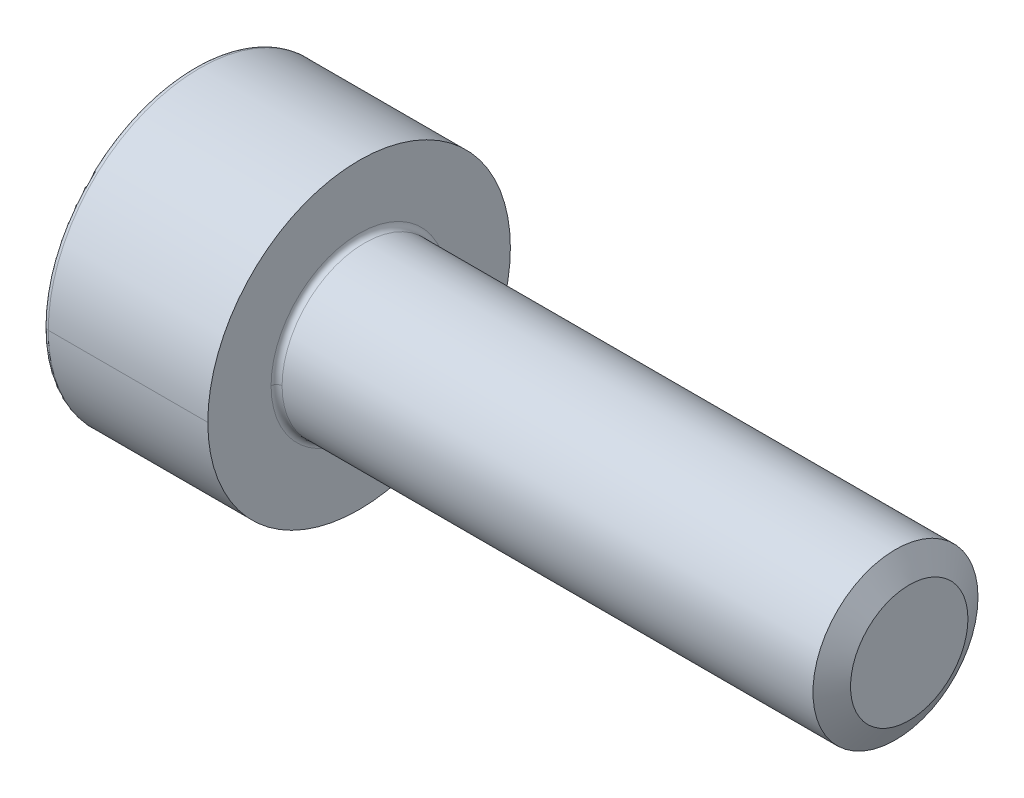
ISO-10303-21;
HEADER;
FILE_DESCRIPTION(('STEP AP214'),'2;1');
FILE_NAME('part.step','',(''),(''),'','','');
FILE_SCHEMA(('AUTOMOTIVE_DESIGN { 1 0 10303 214 1 1 1 1 }'));
ENDSEC;
DATA;
#1=APPLICATION_CONTEXT('core data for automotive mechanical design processes');
#2=APPLICATION_PROTOCOL_DEFINITION('international standard','automotive_design',2000,#1);
#3=PRODUCT_CONTEXT('',#1,'mechanical');
#4=PRODUCT('Part','Part','',(#3));
#5=PRODUCT_RELATED_PRODUCT_CATEGORY('part','',(#4));
#6=PRODUCT_DEFINITION_FORMATION('','',#4);
#7=PRODUCT_DEFINITION_CONTEXT('part definition',#1,'design');
#8=PRODUCT_DEFINITION('design','',#6,#7);
#9=PRODUCT_DEFINITION_SHAPE('','',#8);
#10=(LENGTH_UNIT() NAMED_UNIT(*) SI_UNIT(.MILLI.,.METRE.));
#11=(NAMED_UNIT(*) PLANE_ANGLE_UNIT() SI_UNIT($,.RADIAN.));
#12=(NAMED_UNIT(*) SI_UNIT($,.STERADIAN.) SOLID_ANGLE_UNIT());
#13=UNCERTAINTY_MEASURE_WITH_UNIT(LENGTH_MEASURE(1.E-05),#10,'distance_accuracy_value','');
#14=(GEOMETRIC_REPRESENTATION_CONTEXT(3) GLOBAL_UNCERTAINTY_ASSIGNED_CONTEXT((#13)) GLOBAL_UNIT_ASSIGNED_CONTEXT((#10,
#11,#12)) REPRESENTATION_CONTEXT('',''));
#15=CARTESIAN_POINT('',(0.,0.,0.));
#16=DIRECTION('',(0.,0.,1.));
#17=DIRECTION('',(1.,0.,0.));
#18=AXIS2_PLACEMENT_3D('',#15,#16,#17);
#19=CARTESIAN_POINT('',(0.1,0.,0.));
#20=DIRECTION('',(-1.,0.,0.));
#21=DIRECTION('',(0.,0.,-1.));
#22=AXIS2_PLACEMENT_3D('',#19,#20,#21);
#23=TOROIDAL_SURFACE('',#22,2.65,0.1);
#24=CARTESIAN_POINT('',(0.1,0.,2.65));
#25=DIRECTION('',(0.,-1.,0.));
#26=DIRECTION('',(0.,0.,-1.));
#27=AXIS2_PLACEMENT_3D('',#24,#25,#26);
#28=CIRCLE('',#27,0.1);
#29=CARTESIAN_POINT('',(0.1,0.,2.75));
#30=VERTEX_POINT('',#29);
#31=CARTESIAN_POINT('',(0.,0.,2.65));
#32=VERTEX_POINT('',#31);
#33=EDGE_CURVE('E210',#30,#32,#28,.T.);
#34=ORIENTED_EDGE('',*,*,#33,.T.);
#35=CARTESIAN_POINT('',(0.,0.,0.));
#36=DIRECTION('',(1.,0.,0.));
#37=DIRECTION('',(0.,0.,-1.));
#38=AXIS2_PLACEMENT_3D('',#35,#36,#37);
#39=CIRCLE('',#38,2.65);
#40=CARTESIAN_POINT('',(0.,0.,-2.65));
#41=VERTEX_POINT('',#40);
#42=EDGE_CURVE('E169',#32,#41,#39,.T.);
#43=ORIENTED_EDGE('',*,*,#42,.T.);
#44=CARTESIAN_POINT('',(0.1,0.,-2.65));
#45=DIRECTION('',(0.,1.,0.));
#46=DIRECTION('',(0.,0.,1.));
#47=AXIS2_PLACEMENT_3D('',#44,#45,#46);
#48=CIRCLE('',#47,0.1);
#49=CARTESIAN_POINT('',(0.1,0.,-2.75));
#50=VERTEX_POINT('',#49);
#51=EDGE_CURVE('E224',#50,#41,#48,.T.);
#52=ORIENTED_EDGE('',*,*,#51,.F.);
#53=CARTESIAN_POINT('',(0.1,0.,0.));
#54=DIRECTION('',(-1.,0.,0.));
#55=DIRECTION('',(0.,0.,-1.));
#56=AXIS2_PLACEMENT_3D('',#53,#54,#55);
#57=CIRCLE('',#56,2.75);
#58=EDGE_CURVE('E201',#50,#30,#57,.T.);
#59=ORIENTED_EDGE('',*,*,#58,.T.);
#60=EDGE_LOOP('',(#34,#43,#52,#59));
#61=FACE_BOUND('',#60,.T.);
#62=ADVANCED_FACE('F38',(#61),#23,.T.);
#63=CARTESIAN_POINT('',(1.3,-0.7175,-1.24274645443067));
#64=DIRECTION('',(-1.,0.,0.));
#65=DIRECTION('',(0.,0.,-1.));
#66=AXIS2_PLACEMENT_3D('',#63,#64,#65);
#67=PLANE('',#66);
#68=DIRECTION('',(0.,0.5,-0.866025403784439));
#69=VECTOR('',#68,1.);
#70=CARTESIAN_POINT('',(1.3,-1.435,0.));
#71=LINE('',#70,#69);
#72=CARTESIAN_POINT('',(1.3,-1.435,0.));
#73=VERTEX_POINT('',#72);
#74=CARTESIAN_POINT('',(1.3,-0.7175,-1.24274645443067));
#75=VERTEX_POINT('',#74);
#76=EDGE_CURVE('E252',#73,#75,#71,.T.);
#77=ORIENTED_EDGE('',*,*,#76,.F.);
#78=DIRECTION('',(0.,-0.5,-0.866025403784439));
#79=VECTOR('',#78,1.);
#80=CARTESIAN_POINT('',(1.3,-0.7175,1.24274645443067));
#81=LINE('',#80,#79);
#82=CARTESIAN_POINT('',(1.3,-0.7175,1.24274645443067));
#83=VERTEX_POINT('',#82);
#84=EDGE_CURVE('E257',#83,#73,#81,.T.);
#85=ORIENTED_EDGE('',*,*,#84,.F.);
#86=DIRECTION('',(0.,-1.,0.));
#87=VECTOR('',#86,1.);
#88=CARTESIAN_POINT('',(1.3,0.7175,1.24274645443067));
#89=LINE('',#88,#87);
#90=CARTESIAN_POINT('',(1.3,0.7175,1.24274645443067));
#91=VERTEX_POINT('',#90);
#92=EDGE_CURVE('E243',#91,#83,#89,.T.);
#93=ORIENTED_EDGE('',*,*,#92,.F.);
#94=DIRECTION('',(0.,-0.5,0.866025403784439));
#95=VECTOR('',#94,1.);
#96=CARTESIAN_POINT('',(1.3,1.435,0.));
#97=LINE('',#96,#95);
#98=CARTESIAN_POINT('',(1.3,1.435,0.));
#99=VERTEX_POINT('',#98);
#100=EDGE_CURVE('E176',#99,#91,#97,.T.);
#101=ORIENTED_EDGE('',*,*,#100,.F.);
#102=DIRECTION('',(0.,0.5,0.866025403784439));
#103=VECTOR('',#102,1.);
#104=CARTESIAN_POINT('',(1.3,0.7175,-1.24274645443067));
#105=LINE('',#104,#103);
#106=CARTESIAN_POINT('',(1.3,0.7175,-1.24274645443067));
#107=VERTEX_POINT('',#106);
#108=EDGE_CURVE('E276',#107,#99,#105,.T.);
#109=ORIENTED_EDGE('',*,*,#108,.F.);
#110=DIRECTION('',(0.,1.,0.));
#111=VECTOR('',#110,1.);
#112=CARTESIAN_POINT('',(1.3,-0.7175,-1.24274645443067));
#113=LINE('',#112,#111);
#114=EDGE_CURVE('E11',#75,#107,#113,.T.);
#115=ORIENTED_EDGE('',*,*,#114,.F.);
#116=EDGE_LOOP('',(#77,#85,#93,#101,#109,#115));
#117=FACE_BOUND('',#116,.T.);
#118=ADVANCED_FACE('F340',(#117),#67,.T.);
#119=CARTESIAN_POINT('',(1.3,-0.7175,-1.24274645443067));
#120=DIRECTION('',(0.,0.,-1.));
#121=DIRECTION('',(0.,-1.,0.));
#122=AXIS2_PLACEMENT_3D('',#119,#120,#121);
#123=PLANE('',#122);
#124=DIRECTION('',(0.,1.,0.));
#125=VECTOR('',#124,1.);
#126=CARTESIAN_POINT('',(0.,-0.7175,-1.24274645443067));
#127=LINE('',#126,#125);
#128=CARTESIAN_POINT('',(0.,-0.7175,-1.24274645443067));
#129=VERTEX_POINT('',#128);
#130=CARTESIAN_POINT('',(0.,0.7175,-1.24274645443067));
#131=VERTEX_POINT('',#130);
#132=EDGE_CURVE('E194',#129,#131,#127,.T.);
#133=ORIENTED_EDGE('',*,*,#132,.F.);
#134=DIRECTION('',(-1.,0.,0.));
#135=VECTOR('',#134,1.);
#136=CARTESIAN_POINT('',(1.3,-0.7175,-1.24274645443067));
#137=LINE('',#136,#135);
#138=EDGE_CURVE('E248',#75,#129,#137,.T.);
#139=ORIENTED_EDGE('',*,*,#138,.F.);
#140=ORIENTED_EDGE('',*,*,#114,.T.);
#141=DIRECTION('',(-1.,0.,0.));
#142=VECTOR('',#141,1.);
#143=CARTESIAN_POINT('',(1.3,0.7175,-1.24274645443067));
#144=LINE('',#143,#142);
#145=EDGE_CURVE('E49',#107,#131,#144,.T.);
#146=ORIENTED_EDGE('',*,*,#145,.T.);
#147=EDGE_LOOP('',(#133,#139,#140,#146));
#148=FACE_BOUND('',#147,.T.);
#149=ADVANCED_FACE('F345',(#148),#123,.F.);
#150=CARTESIAN_POINT('',(1.3,0.7175,-1.24274645443067));
#151=DIRECTION('',(0.,0.866025403784439,-0.5));
#152=DIRECTION('',(1.,0.,0.));
#153=AXIS2_PLACEMENT_3D('',#150,#151,#152);
#154=PLANE('',#153);
#155=DIRECTION('',(0.,0.5,0.866025403784439));
#156=VECTOR('',#155,1.);
#157=CARTESIAN_POINT('',(0.,0.7175,-1.24274645443067));
#158=LINE('',#157,#156);
#159=CARTESIAN_POINT('',(0.,1.435,0.));
#160=VERTEX_POINT('',#159);
#161=EDGE_CURVE('E191',#131,#160,#158,.T.);
#162=ORIENTED_EDGE('',*,*,#161,.F.);
#163=ORIENTED_EDGE('',*,*,#145,.F.);
#164=ORIENTED_EDGE('',*,*,#108,.T.);
#165=DIRECTION('',(-1.,0.,0.));
#166=VECTOR('',#165,1.);
#167=CARTESIAN_POINT('',(1.3,1.435,0.));
#168=LINE('',#167,#166);
#169=EDGE_CURVE('E273',#99,#160,#168,.T.);
#170=ORIENTED_EDGE('',*,*,#169,.T.);
#171=EDGE_LOOP('',(#162,#163,#164,#170));
#172=FACE_BOUND('',#171,.T.);
#173=ADVANCED_FACE('F357',(#172),#154,.F.);
#174=CARTESIAN_POINT('',(1.3,1.435,0.));
#175=DIRECTION('',(0.,0.866025403784439,0.5));
#176=DIRECTION('',(-1.,0.,0.));
#177=AXIS2_PLACEMENT_3D('',#174,#175,#176);
#178=PLANE('',#177);
#179=DIRECTION('',(0.,-0.5,0.866025403784439));
#180=VECTOR('',#179,1.);
#181=CARTESIAN_POINT('',(0.,1.435,0.));
#182=LINE('',#181,#180);
#183=CARTESIAN_POINT('',(0.,0.7175,1.24274645443067));
#184=VERTEX_POINT('',#183);
#185=EDGE_CURVE('E189',#160,#184,#182,.T.);
#186=ORIENTED_EDGE('',*,*,#185,.F.);
#187=ORIENTED_EDGE('',*,*,#169,.F.);
#188=ORIENTED_EDGE('',*,*,#100,.T.);
#189=DIRECTION('',(-1.,0.,0.));
#190=VECTOR('',#189,1.);
#191=CARTESIAN_POINT('',(1.3,0.7175,1.24274645443067));
#192=LINE('',#191,#190);
#193=EDGE_CURVE('E277',#91,#184,#192,.T.);
#194=ORIENTED_EDGE('',*,*,#193,.T.);
#195=EDGE_LOOP('',(#186,#187,#188,#194));
#196=FACE_BOUND('',#195,.T.);
#197=ADVANCED_FACE('F353',(#196),#178,.F.);
#198=CARTESIAN_POINT('',(1.3,0.7175,1.24274645443067));
#199=DIRECTION('',(0.,0.,1.));
#200=DIRECTION('',(0.,-1.,0.));
#201=AXIS2_PLACEMENT_3D('',#198,#199,#200);
#202=PLANE('',#201);
#203=DIRECTION('',(0.,-1.,0.));
#204=VECTOR('',#203,1.);
#205=CARTESIAN_POINT('',(0.,0.7175,1.24274645443067));
#206=LINE('',#205,#204);
#207=CARTESIAN_POINT('',(0.,-0.7175,1.24274645443067));
#208=VERTEX_POINT('',#207);
#209=EDGE_CURVE('E186',#184,#208,#206,.T.);
#210=ORIENTED_EDGE('',*,*,#209,.F.);
#211=ORIENTED_EDGE('',*,*,#193,.F.);
#212=ORIENTED_EDGE('',*,*,#92,.T.);
#213=DIRECTION('',(-1.,0.,0.));
#214=VECTOR('',#213,1.);
#215=CARTESIAN_POINT('',(1.3,-0.7175,1.24274645443067));
#216=LINE('',#215,#214);
#217=EDGE_CURVE('E42',#83,#208,#216,.T.);
#218=ORIENTED_EDGE('',*,*,#217,.T.);
#219=EDGE_LOOP('',(#210,#211,#212,#218));
#220=FACE_BOUND('',#219,.T.);
#221=ADVANCED_FACE('F349',(#220),#202,.F.);
#222=CARTESIAN_POINT('',(1.3,-0.7175,1.24274645443067));
#223=DIRECTION('',(0.,-0.866025403784439,0.5));
#224=DIRECTION('',(0.,0.5,0.866025403784439));
#225=AXIS2_PLACEMENT_3D('',#222,#223,#224);
#226=PLANE('',#225);
#227=DIRECTION('',(0.,-0.5,-0.866025403784439));
#228=VECTOR('',#227,1.);
#229=CARTESIAN_POINT('',(0.,-0.7175,1.24274645443067));
#230=LINE('',#229,#228);
#231=CARTESIAN_POINT('',(0.,-1.435,0.));
#232=VERTEX_POINT('',#231);
#233=EDGE_CURVE('E190',#208,#232,#230,.T.);
#234=ORIENTED_EDGE('',*,*,#233,.F.);
#235=ORIENTED_EDGE('',*,*,#217,.F.);
#236=ORIENTED_EDGE('',*,*,#84,.T.);
#237=DIRECTION('',(-1.,0.,0.));
#238=VECTOR('',#237,1.);
#239=CARTESIAN_POINT('',(1.3,-1.435,0.));
#240=LINE('',#239,#238);
#241=EDGE_CURVE('E255',#73,#232,#240,.T.);
#242=ORIENTED_EDGE('',*,*,#241,.T.);
#243=EDGE_LOOP('',(#234,#235,#236,#242));
#244=FACE_BOUND('',#243,.T.);
#245=ADVANCED_FACE('F352',(#244),#226,.F.);
#246=CARTESIAN_POINT('',(1.3,-1.435,0.));
#247=DIRECTION('',(0.,-0.866025403784439,-0.5));
#248=DIRECTION('',(-1.,0.,0.));
#249=AXIS2_PLACEMENT_3D('',#246,#247,#248);
#250=PLANE('',#249);
#251=DIRECTION('',(0.,0.5,-0.866025403784439));
#252=VECTOR('',#251,1.);
#253=CARTESIAN_POINT('',(0.,-1.435,0.));
#254=LINE('',#253,#252);
#255=EDGE_CURVE('E180',#232,#129,#254,.T.);
#256=ORIENTED_EDGE('',*,*,#255,.F.);
#257=ORIENTED_EDGE('',*,*,#241,.F.);
#258=ORIENTED_EDGE('',*,*,#76,.T.);
#259=ORIENTED_EDGE('',*,*,#138,.T.);
#260=EDGE_LOOP('',(#256,#257,#258,#259));
#261=FACE_BOUND('',#260,.T.);
#262=ADVANCED_FACE('F366',(#261),#250,.F.);
#263=CARTESIAN_POINT('',(3.1,0.,0.));
#264=DIRECTION('',(1.,0.,0.));
#265=DIRECTION('',(0.,0.,1.));
#266=AXIS2_PLACEMENT_3D('',#263,#264,#265);
#267=TOROIDAL_SURFACE('',#266,1.6,0.1);
#268=CARTESIAN_POINT('',(3.1,0.,-1.6));
#269=DIRECTION('',(0.,-1.,0.));
#270=DIRECTION('',(0.,0.,-1.));
#271=AXIS2_PLACEMENT_3D('',#268,#269,#270);
#272=CIRCLE('',#271,0.1);
#273=CARTESIAN_POINT('',(3.1,0.,-1.5));
#274=VERTEX_POINT('',#273);
#275=CARTESIAN_POINT('',(3.,0.,-1.6));
#276=VERTEX_POINT('',#275);
#277=EDGE_CURVE('E272',#274,#276,#272,.T.);
#278=ORIENTED_EDGE('',*,*,#277,.T.);
#279=CARTESIAN_POINT('',(3.,0.,0.));
#280=DIRECTION('',(-1.,0.,0.));
#281=DIRECTION('',(0.,0.,1.));
#282=AXIS2_PLACEMENT_3D('',#279,#280,#281);
#283=CIRCLE('',#282,1.6);
#284=CARTESIAN_POINT('',(3.,0.,1.6));
#285=VERTEX_POINT('',#284);
#286=EDGE_CURVE('E215',#285,#276,#283,.T.);
#287=ORIENTED_EDGE('',*,*,#286,.F.);
#288=CARTESIAN_POINT('',(3.1,0.,1.6));
#289=DIRECTION('',(0.,1.,0.));
#290=DIRECTION('',(0.,0.,1.));
#291=AXIS2_PLACEMENT_3D('',#288,#289,#290);
#292=CIRCLE('',#291,0.1);
#293=CARTESIAN_POINT('',(3.1,0.,1.5));
#294=VERTEX_POINT('',#293);
#295=EDGE_CURVE('E185',#294,#285,#292,.T.);
#296=ORIENTED_EDGE('',*,*,#295,.F.);
#297=CARTESIAN_POINT('',(3.1,0.,0.));
#298=DIRECTION('',(-1.,0.,0.));
#299=DIRECTION('',(0.,0.,1.));
#300=AXIS2_PLACEMENT_3D('',#297,#298,#299);
#301=CIRCLE('',#300,1.5);
#302=EDGE_CURVE('E163',#294,#274,#301,.T.);
#303=ORIENTED_EDGE('',*,*,#302,.T.);
#304=EDGE_LOOP('',(#278,#287,#296,#303));
#305=FACE_BOUND('',#304,.T.);
#306=ADVANCED_FACE('F312',(#305),#267,.F.);
#307=CARTESIAN_POINT('',(3.,2.75,0.));
#308=DIRECTION('',(1.,0.,0.));
#309=DIRECTION('',(0.,1.,0.));
#310=AXIS2_PLACEMENT_3D('',#307,#308,#309);
#311=PLANE('',#310);
#312=ORIENTED_EDGE('',*,*,#286,.T.);
#313=CARTESIAN_POINT('',(3.,0.,0.));
#314=DIRECTION('',(-1.,0.,0.));
#315=DIRECTION('',(0.,0.,1.));
#316=AXIS2_PLACEMENT_3D('',#313,#314,#315);
#317=CIRCLE('',#316,1.6);
#318=EDGE_CURVE('E284',#276,#285,#317,.T.);
#319=ORIENTED_EDGE('',*,*,#318,.T.);
#320=EDGE_LOOP('',(#312,#319));
#321=FACE_BOUND('',#320,.T.);
#322=CARTESIAN_POINT('',(3.,0.,0.));
#323=DIRECTION('',(-1.,0.,0.));
#324=DIRECTION('',(0.,0.,1.));
#325=AXIS2_PLACEMENT_3D('',#322,#323,#324);
#326=CIRCLE('',#325,2.75);
#327=CARTESIAN_POINT('',(3.,0.,2.75));
#328=VERTEX_POINT('',#327);
#329=CARTESIAN_POINT('',(3.,0.,-2.75));
#330=VERTEX_POINT('',#329);
#331=EDGE_CURVE('E184',#328,#330,#326,.T.);
#332=ORIENTED_EDGE('',*,*,#331,.F.);
#333=CARTESIAN_POINT('',(3.,0.,0.));
#334=DIRECTION('',(-1.,0.,0.));
#335=DIRECTION('',(0.,0.,1.));
#336=AXIS2_PLACEMENT_3D('',#333,#334,#335);
#337=CIRCLE('',#336,2.75);
#338=EDGE_CURVE('E212',#330,#328,#337,.T.);
#339=ORIENTED_EDGE('',*,*,#338,.F.);
#340=EDGE_LOOP('',(#332,#339));
#341=FACE_BOUND('',#340,.T.);
#342=ADVANCED_FACE('F307',(#321,#341),#311,.T.);
#343=CARTESIAN_POINT('',(0.,0.,0.));
#344=DIRECTION('',(1.,0.,0.));
#345=DIRECTION('',(0.,0.,1.));
#346=AXIS2_PLACEMENT_3D('',#343,#344,#345);
#347=CYLINDRICAL_SURFACE('',#346,2.75);
#348=DIRECTION('',(1.,0.,0.));
#349=VECTOR('',#348,1.);
#350=CARTESIAN_POINT('',(0.,0.,-2.75));
#351=LINE('',#350,#349);
#352=EDGE_CURVE('E181',#50,#330,#351,.T.);
#353=ORIENTED_EDGE('',*,*,#352,.T.);
#354=ORIENTED_EDGE('',*,*,#338,.T.);
#355=DIRECTION('',(1.,0.,0.));
#356=VECTOR('',#355,1.);
#357=CARTESIAN_POINT('',(0.,0.,2.75));
#358=LINE('',#357,#356);
#359=EDGE_CURVE('E172',#30,#328,#358,.T.);
#360=ORIENTED_EDGE('',*,*,#359,.F.);
#361=ORIENTED_EDGE('',*,*,#58,.F.);
#362=EDGE_LOOP('',(#353,#354,#360,#361));
#363=FACE_BOUND('',#362,.T.);
#364=ADVANCED_FACE('F335',(#363),#347,.T.);
#365=CARTESIAN_POINT('',(0.,0.,0.));
#366=DIRECTION('',(-1.,0.,0.));
#367=DIRECTION('',(0.,0.,-1.));
#368=AXIS2_PLACEMENT_3D('',#365,#366,#367);
#369=PLANE('',#368);
#370=ORIENTED_EDGE('',*,*,#255,.T.);
#371=ORIENTED_EDGE('',*,*,#132,.T.);
#372=ORIENTED_EDGE('',*,*,#161,.T.);
#373=ORIENTED_EDGE('',*,*,#185,.T.);
#374=ORIENTED_EDGE('',*,*,#209,.T.);
#375=ORIENTED_EDGE('',*,*,#233,.T.);
#376=EDGE_LOOP('',(#370,#371,#372,#373,#374,#375));
#377=FACE_BOUND('',#376,.T.);
#378=CARTESIAN_POINT('',(0.,0.,0.));
#379=DIRECTION('',(1.,0.,0.));
#380=DIRECTION('',(0.,0.,-1.));
#381=AXIS2_PLACEMENT_3D('',#378,#379,#380);
#382=CIRCLE('',#381,2.65);
#383=EDGE_CURVE('E226',#41,#32,#382,.T.);
#384=ORIENTED_EDGE('',*,*,#383,.F.);
#385=ORIENTED_EDGE('',*,*,#42,.F.);
#386=EDGE_LOOP('',(#384,#385));
#387=FACE_BOUND('',#386,.T.);
#388=ADVANCED_FACE('F327',(#377,#387),#369,.T.);
#389=CARTESIAN_POINT('',(0.,0.,0.));
#390=DIRECTION('',(1.,0.,0.));
#391=DIRECTION('',(0.,0.,1.));
#392=AXIS2_PLACEMENT_3D('',#389,#390,#391);
#393=CYLINDRICAL_SURFACE('',#392,1.5);
#394=ORIENTED_EDGE('',*,*,#302,.F.);
#395=DIRECTION('',(1.,0.,0.));
#396=VECTOR('',#395,1.);
#397=CARTESIAN_POINT('',(0.,0.,1.5));
#398=LINE('',#397,#396);
#399=CARTESIAN_POINT('',(10.75,0.,1.5));
#400=VERTEX_POINT('',#399);
#401=EDGE_CURVE('E162',#294,#400,#398,.T.);
#402=ORIENTED_EDGE('',*,*,#401,.T.);
#403=ORIENTED_EDGE('',*,*,#401,.F.);
#404=CARTESIAN_POINT('',(3.1,0.,0.));
#405=DIRECTION('',(-1.,0.,0.));
#406=DIRECTION('',(0.,0.,1.));
#407=AXIS2_PLACEMENT_3D('',#404,#405,#406);
#408=CIRCLE('',#407,1.5);
#409=EDGE_CURVE('E159',#274,#294,#408,.T.);
#410=ORIENTED_EDGE('',*,*,#409,.F.);
#411=DIRECTION('',(1.,0.,0.));
#412=VECTOR('',#411,1.);
#413=CARTESIAN_POINT('',(0.,0.,-1.5));
#414=LINE('',#413,#412);
#415=CARTESIAN_POINT('',(10.75,0.,-1.5));
#416=VERTEX_POINT('',#415);
#417=EDGE_CURVE('E154',#274,#416,#414,.T.);
#418=ORIENTED_EDGE('',*,*,#417,.T.);
#419=ORIENTED_EDGE('',*,*,#417,.F.);
#420=EDGE_LOOP('',(#394,#402,#403,#410,#418,#419));
#421=FACE_BOUND('',#420,.T.);
#422=CARTESIAN_POINT('',(12.75,0.,0.));
#423=DIRECTION('',(1.,0.,0.));
#424=DIRECTION('',(0.,0.,-1.));
#425=AXIS2_PLACEMENT_3D('',#422,#423,#424);
#426=CIRCLE('',#425,1.5);
#427=CARTESIAN_POINT('',(12.75,0.,-1.5));
#428=VERTEX_POINT('',#427);
#429=EDGE_CURVE('E239',#428,#428,#426,.T.);
#430=ORIENTED_EDGE('',*,*,#429,.F.);
#431=EDGE_LOOP('',(#430));
#432=FACE_BOUND('',#431,.T.);
#433=ADVANCED_FACE('F156',(#421,#432),#393,.T.);
#434=CARTESIAN_POINT('',(0.,0.,0.));
#435=DIRECTION('',(1.,0.,0.));
#436=DIRECTION('',(0.,0.,1.));
#437=AXIS2_PLACEMENT_3D('',#434,#435,#436);
#438=CYLINDRICAL_SURFACE('',#437,2.75);
#439=CARTESIAN_POINT('',(0.1,0.,0.));
#440=DIRECTION('',(-1.,0.,0.));
#441=DIRECTION('',(0.,0.,-1.));
#442=AXIS2_PLACEMENT_3D('',#439,#440,#441);
#443=CIRCLE('',#442,2.75);
#444=EDGE_CURVE('E121',#30,#50,#443,.T.);
#445=ORIENTED_EDGE('',*,*,#444,.F.);
#446=ORIENTED_EDGE('',*,*,#359,.T.);
#447=ORIENTED_EDGE('',*,*,#331,.T.);
#448=ORIENTED_EDGE('',*,*,#352,.F.);
#449=EDGE_LOOP('',(#445,#446,#447,#448));
#450=FACE_BOUND('',#449,.T.);
#451=ADVANCED_FACE('F326',(#450),#438,.T.);
#452=CARTESIAN_POINT('',(3.1,0.,0.));
#453=DIRECTION('',(1.,0.,0.));
#454=DIRECTION('',(0.,0.,1.));
#455=AXIS2_PLACEMENT_3D('',#452,#453,#454);
#456=TOROIDAL_SURFACE('',#455,1.6,0.1);
#457=ORIENTED_EDGE('',*,*,#409,.T.);
#458=ORIENTED_EDGE('',*,*,#295,.T.);
#459=ORIENTED_EDGE('',*,*,#318,.F.);
#460=ORIENTED_EDGE('',*,*,#277,.F.);
#461=EDGE_LOOP('',(#457,#458,#459,#460));
#462=FACE_BOUND('',#461,.T.);
#463=ADVANCED_FACE('F333',(#462),#456,.F.);
#464=CARTESIAN_POINT('',(0.1,0.,0.));
#465=DIRECTION('',(-1.,0.,0.));
#466=DIRECTION('',(0.,0.,-1.));
#467=AXIS2_PLACEMENT_3D('',#464,#465,#466);
#468=TOROIDAL_SURFACE('',#467,2.65,0.1);
#469=ORIENTED_EDGE('',*,*,#444,.T.);
#470=ORIENTED_EDGE('',*,*,#51,.T.);
#471=ORIENTED_EDGE('',*,*,#383,.T.);
#472=ORIENTED_EDGE('',*,*,#33,.F.);
#473=EDGE_LOOP('',(#469,#470,#471,#472));
#474=FACE_BOUND('',#473,.T.);
#475=ADVANCED_FACE('F40',(#474),#468,.T.);
#476=CARTESIAN_POINT('',(13.,0.,0.));
#477=DIRECTION('',(-1.,0.,0.));
#478=DIRECTION('',(0.,0.,-1.));
#479=AXIS2_PLACEMENT_3D('',#476,#477,#478);
#480=PLANE('',#479);
#481=CARTESIAN_POINT('',(13.,0.,0.));
#482=DIRECTION('',(1.,0.,0.));
#483=DIRECTION('',(0.,0.,-1.));
#484=AXIS2_PLACEMENT_3D('',#481,#482,#483);
#485=CIRCLE('',#484,1.067);
#486=CARTESIAN_POINT('',(13.,0.,-1.067));
#487=VERTEX_POINT('',#486);
#488=EDGE_CURVE('E233',#487,#487,#485,.T.);
#489=ORIENTED_EDGE('',*,*,#488,.T.);
#490=EDGE_LOOP('',(#489));
#491=FACE_BOUND('',#490,.T.);
#492=ADVANCED_FACE('F389',(#491),#480,.F.);
#493=CARTESIAN_POINT('',(13.,0.,0.));
#494=DIRECTION('',(-1.,0.,0.));
#495=DIRECTION('',(0.,0.,-1.));
#496=AXIS2_PLACEMENT_3D('',#493,#494,#495);
#497=CONICAL_SURFACE('',#496,1.067,1.04718484902493);
#498=ORIENTED_EDGE('',*,*,#429,.T.);
#499=EDGE_LOOP('',(#498));
#500=FACE_BOUND('',#499,.T.);
#501=ORIENTED_EDGE('',*,*,#488,.F.);
#502=EDGE_LOOP('',(#501));
#503=FACE_BOUND('',#502,.T.);
#504=ADVANCED_FACE('F323',(#500,#503),#497,.T.);
#505=CLOSED_SHELL('',(#62,#118,#149,#173,#197,#221,#245,#262,#306,#342,#364,#388,#433,#451,#463,
#475,#492,#504));
#506=MANIFOLD_SOLID_BREP('B2',#505);
#507=ADVANCED_BREP_SHAPE_REPRESENTATION('',(#18,#506),#14);
#508=SHAPE_DEFINITION_REPRESENTATION(#9,#507);
ENDSEC;
END-ISO-10303-21;
